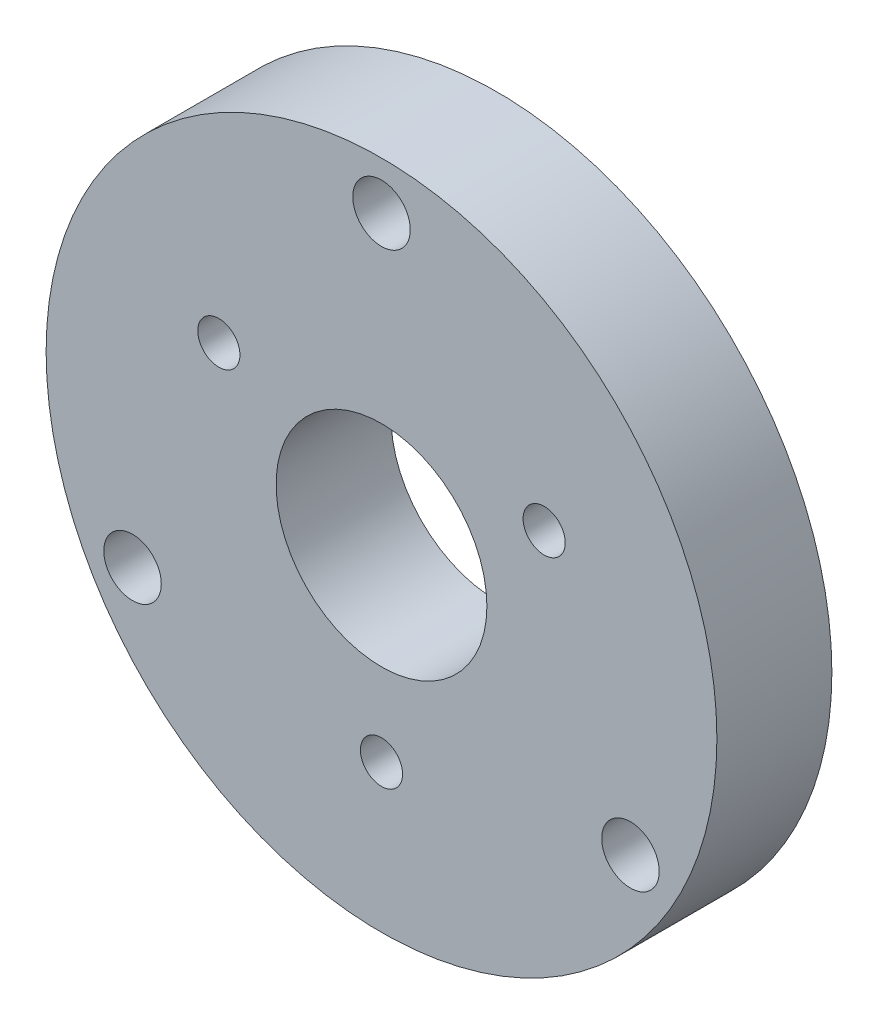
ISO-10303-21;
HEADER;
FILE_DESCRIPTION(('STEP AP214'),'2;1');
FILE_NAME('part.step','',(''),(''),'','','');
FILE_SCHEMA(('AUTOMOTIVE_DESIGN { 1 0 10303 214 1 1 1 1 }'));
ENDSEC;
DATA;
#1=APPLICATION_CONTEXT('core data for automotive mechanical design processes');
#2=APPLICATION_PROTOCOL_DEFINITION('international standard','automotive_design',2000,#1);
#3=PRODUCT_CONTEXT('',#1,'mechanical');
#4=PRODUCT('Part','Part','',(#3));
#5=PRODUCT_RELATED_PRODUCT_CATEGORY('part','',(#4));
#6=PRODUCT_DEFINITION_FORMATION('','',#4);
#7=PRODUCT_DEFINITION_CONTEXT('part definition',#1,'design');
#8=PRODUCT_DEFINITION('design','',#6,#7);
#9=PRODUCT_DEFINITION_SHAPE('','',#8);
#10=(LENGTH_UNIT() NAMED_UNIT(*) SI_UNIT(.MILLI.,.METRE.));
#11=(NAMED_UNIT(*) PLANE_ANGLE_UNIT() SI_UNIT($,.RADIAN.));
#12=(NAMED_UNIT(*) SI_UNIT($,.STERADIAN.) SOLID_ANGLE_UNIT());
#13=UNCERTAINTY_MEASURE_WITH_UNIT(LENGTH_MEASURE(1.E-05),#10,'distance_accuracy_value','');
#14=(GEOMETRIC_REPRESENTATION_CONTEXT(3) GLOBAL_UNCERTAINTY_ASSIGNED_CONTEXT((#13)) GLOBAL_UNIT_ASSIGNED_CONTEXT((#10,
#11,#12)) REPRESENTATION_CONTEXT('',''));
#15=CARTESIAN_POINT('',(0.,0.,0.));
#16=DIRECTION('',(0.,0.,1.));
#17=DIRECTION('',(1.,0.,0.));
#18=AXIS2_PLACEMENT_3D('',#15,#16,#17);
#19=CARTESIAN_POINT('',(0.,0.,6.));
#20=DIRECTION('',(0.,0.,1.));
#21=DIRECTION('',(1.,0.,0.));
#22=AXIS2_PLACEMENT_3D('',#19,#20,#21);
#23=PLANE('',#22);
#24=CARTESIAN_POINT('',(8.48704895708752,4.90000000000059,6.));
#25=DIRECTION('',(0.,0.,1.));
#26=DIRECTION('',(1.,0.,0.));
#27=AXIS2_PLACEMENT_3D('',#24,#25,#26);
#28=CIRCLE('',#27,1.1);
#29=CARTESIAN_POINT('',(9.58704895708752,4.90000000000059,6.));
#30=VERTEX_POINT('',#29);
#31=EDGE_CURVE('E74',#30,#30,#28,.F.);
#32=ORIENTED_EDGE('',*,*,#31,.T.);
#33=EDGE_LOOP('',(#32));
#34=FACE_BOUND('',#33,.T.);
#35=CARTESIAN_POINT('',(-12.9903810567656,-7.50000000000056,6.));
#36=DIRECTION('',(0.,0.,1.));
#37=DIRECTION('',(1.,0.,0.));
#38=AXIS2_PLACEMENT_3D('',#35,#36,#37);
#39=CIRCLE('',#38,1.50000000000122);
#40=CARTESIAN_POINT('',(-11.4903810567644,-7.50000000000056,6.));
#41=VERTEX_POINT('',#40);
#42=EDGE_CURVE('E60',#41,#41,#39,.T.);
#43=ORIENTED_EDGE('',*,*,#42,.F.);
#44=EDGE_LOOP('',(#43));
#45=FACE_BOUND('',#44,.T.);
#46=CARTESIAN_POINT('',(0.,0.,6.));
#47=DIRECTION('',(0.,0.,1.));
#48=DIRECTION('',(1.,0.,0.));
#49=AXIS2_PLACEMENT_3D('',#46,#47,#48);
#50=CIRCLE('',#49,5.5);
#51=CARTESIAN_POINT('',(5.5,0.,6.));
#52=VERTEX_POINT('',#51);
#53=EDGE_CURVE('E48',#52,#52,#50,.T.);
#54=ORIENTED_EDGE('',*,*,#53,.F.);
#55=EDGE_LOOP('',(#54));
#56=FACE_BOUND('',#55,.T.);
#57=CARTESIAN_POINT('',(0.,0.,6.));
#58=DIRECTION('',(0.,0.,1.));
#59=DIRECTION('',(1.,0.,0.));
#60=AXIS2_PLACEMENT_3D('',#57,#58,#59);
#61=CIRCLE('',#60,17.5);
#62=CARTESIAN_POINT('',(17.5,0.,6.));
#63=VERTEX_POINT('',#62);
#64=EDGE_CURVE('E10',#63,#63,#61,.T.);
#65=ORIENTED_EDGE('',*,*,#64,.T.);
#66=EDGE_LOOP('',(#65));
#67=FACE_BOUND('',#66,.T.);
#68=CARTESIAN_POINT('',(0.,15.,6.));
#69=DIRECTION('',(0.,0.,1.));
#70=DIRECTION('',(1.,0.,0.));
#71=AXIS2_PLACEMENT_3D('',#68,#69,#70);
#72=CIRCLE('',#71,1.5);
#73=CARTESIAN_POINT('',(1.5,15.,6.));
#74=VERTEX_POINT('',#73);
#75=EDGE_CURVE('E43',#74,#74,#72,.T.);
#76=ORIENTED_EDGE('',*,*,#75,.F.);
#77=EDGE_LOOP('',(#76));
#78=FACE_BOUND('',#77,.T.);
#79=CARTESIAN_POINT('',(12.9903810567675,-7.49999999999944,6.));
#80=DIRECTION('',(0.,0.,1.));
#81=DIRECTION('',(1.,0.,0.));
#82=AXIS2_PLACEMENT_3D('',#79,#80,#81);
#83=CIRCLE('',#82,1.50000000000082);
#84=CARTESIAN_POINT('',(14.4903810567684,-7.49999999999944,6.));
#85=VERTEX_POINT('',#84);
#86=EDGE_CURVE('E54',#85,#85,#83,.T.);
#87=ORIENTED_EDGE('',*,*,#86,.F.);
#88=EDGE_LOOP('',(#87));
#89=FACE_BOUND('',#88,.T.);
#90=CARTESIAN_POINT('',(-8.48704895708748,4.90000000000004,6.));
#91=DIRECTION('',(0.,0.,1.));
#92=DIRECTION('',(1.,0.,0.));
#93=AXIS2_PLACEMENT_3D('',#90,#91,#92);
#94=CIRCLE('',#93,1.1);
#95=CARTESIAN_POINT('',(-7.38704895708748,4.90000000000004,6.));
#96=VERTEX_POINT('',#95);
#97=EDGE_CURVE('E66',#96,#96,#94,.F.);
#98=ORIENTED_EDGE('',*,*,#97,.T.);
#99=EDGE_LOOP('',(#98));
#100=FACE_BOUND('',#99,.T.);
#101=CARTESIAN_POINT('',(4.9789781200289E-13,-9.79999999999969,6.));
#102=DIRECTION('',(0.,0.,1.));
#103=DIRECTION('',(1.,0.,0.));
#104=AXIS2_PLACEMENT_3D('',#101,#102,#103);
#105=CIRCLE('',#104,1.1);
#106=CARTESIAN_POINT('',(1.1000000000005,-9.79999999999969,6.));
#107=VERTEX_POINT('',#106);
#108=EDGE_CURVE('E80',#107,#107,#105,.F.);
#109=ORIENTED_EDGE('',*,*,#108,.T.);
#110=EDGE_LOOP('',(#109));
#111=FACE_BOUND('',#110,.T.);
#112=ADVANCED_FACE('F32',(#34,#45,#56,#67,#78,#89,#100,#111),#23,.T.);
#113=CARTESIAN_POINT('',(0.,0.,0.));
#114=DIRECTION('',(0.,0.,1.));
#115=DIRECTION('',(1.,0.,0.));
#116=AXIS2_PLACEMENT_3D('',#113,#114,#115);
#117=PLANE('',#116);
#118=CARTESIAN_POINT('',(8.48704895708752,4.90000000000059,0.));
#119=DIRECTION('',(0.,0.,1.));
#120=DIRECTION('',(1.,0.,0.));
#121=AXIS2_PLACEMENT_3D('',#118,#119,#120);
#122=CIRCLE('',#121,1.1);
#123=CARTESIAN_POINT('',(9.58704895708752,4.90000000000059,0.));
#124=VERTEX_POINT('',#123);
#125=EDGE_CURVE('E77',#124,#124,#122,.T.);
#126=ORIENTED_EDGE('',*,*,#125,.T.);
#127=EDGE_LOOP('',(#126));
#128=FACE_BOUND('',#127,.T.);
#129=CARTESIAN_POINT('',(-12.9903810567656,-7.50000000000056,0.));
#130=DIRECTION('',(0.,0.,1.));
#131=DIRECTION('',(1.,0.,0.));
#132=AXIS2_PLACEMENT_3D('',#129,#130,#131);
#133=CIRCLE('',#132,1.50000000000122);
#134=CARTESIAN_POINT('',(-11.4903810567644,-7.50000000000056,0.));
#135=VERTEX_POINT('',#134);
#136=EDGE_CURVE('E63',#135,#135,#133,.T.);
#137=ORIENTED_EDGE('',*,*,#136,.T.);
#138=EDGE_LOOP('',(#137));
#139=FACE_BOUND('',#138,.T.);
#140=CARTESIAN_POINT('',(0.,0.,0.));
#141=DIRECTION('',(0.,0.,1.));
#142=DIRECTION('',(1.,0.,0.));
#143=AXIS2_PLACEMENT_3D('',#140,#141,#142);
#144=CIRCLE('',#143,5.5);
#145=CARTESIAN_POINT('',(5.5,0.,0.));
#146=VERTEX_POINT('',#145);
#147=EDGE_CURVE('E51',#146,#146,#144,.T.);
#148=ORIENTED_EDGE('',*,*,#147,.T.);
#149=EDGE_LOOP('',(#148));
#150=FACE_BOUND('',#149,.T.);
#151=CARTESIAN_POINT('',(0.,0.,0.));
#152=DIRECTION('',(0.,0.,1.));
#153=DIRECTION('',(1.,0.,0.));
#154=AXIS2_PLACEMENT_3D('',#151,#152,#153);
#155=CIRCLE('',#154,17.5);
#156=CARTESIAN_POINT('',(17.5,0.,0.));
#157=VERTEX_POINT('',#156);
#158=EDGE_CURVE('E36',#157,#157,#155,.T.);
#159=ORIENTED_EDGE('',*,*,#158,.F.);
#160=EDGE_LOOP('',(#159));
#161=FACE_BOUND('',#160,.T.);
#162=CARTESIAN_POINT('',(0.,15.,0.));
#163=DIRECTION('',(0.,0.,1.));
#164=DIRECTION('',(1.,0.,0.));
#165=AXIS2_PLACEMENT_3D('',#162,#163,#164);
#166=CIRCLE('',#165,1.5);
#167=CARTESIAN_POINT('',(1.5,15.,0.));
#168=VERTEX_POINT('',#167);
#169=EDGE_CURVE('E45',#168,#168,#166,.T.);
#170=ORIENTED_EDGE('',*,*,#169,.T.);
#171=EDGE_LOOP('',(#170));
#172=FACE_BOUND('',#171,.T.);
#173=CARTESIAN_POINT('',(12.9903810567675,-7.49999999999944,0.));
#174=DIRECTION('',(0.,0.,1.));
#175=DIRECTION('',(1.,0.,0.));
#176=AXIS2_PLACEMENT_3D('',#173,#174,#175);
#177=CIRCLE('',#176,1.50000000000082);
#178=CARTESIAN_POINT('',(14.4903810567684,-7.49999999999944,0.));
#179=VERTEX_POINT('',#178);
#180=EDGE_CURVE('E57',#179,#179,#177,.T.);
#181=ORIENTED_EDGE('',*,*,#180,.T.);
#182=EDGE_LOOP('',(#181));
#183=FACE_BOUND('',#182,.T.);
#184=CARTESIAN_POINT('',(-8.48704895708748,4.90000000000004,0.));
#185=DIRECTION('',(0.,0.,1.));
#186=DIRECTION('',(1.,0.,0.));
#187=AXIS2_PLACEMENT_3D('',#184,#185,#186);
#188=CIRCLE('',#187,1.1);
#189=CARTESIAN_POINT('',(-7.38704895708748,4.90000000000004,0.));
#190=VERTEX_POINT('',#189);
#191=EDGE_CURVE('E71',#190,#190,#188,.T.);
#192=ORIENTED_EDGE('',*,*,#191,.T.);
#193=EDGE_LOOP('',(#192));
#194=FACE_BOUND('',#193,.T.);
#195=CARTESIAN_POINT('',(4.9789781200289E-13,-9.79999999999969,0.));
#196=DIRECTION('',(0.,0.,1.));
#197=DIRECTION('',(1.,0.,0.));
#198=AXIS2_PLACEMENT_3D('',#195,#196,#197);
#199=CIRCLE('',#198,1.1);
#200=CARTESIAN_POINT('',(1.1000000000005,-9.79999999999969,0.));
#201=VERTEX_POINT('',#200);
#202=EDGE_CURVE('E83',#201,#201,#199,.T.);
#203=ORIENTED_EDGE('',*,*,#202,.T.);
#204=EDGE_LOOP('',(#203));
#205=FACE_BOUND('',#204,.T.);
#206=ADVANCED_FACE('F87',(#128,#139,#150,#161,#172,#183,#194,#205),#117,.F.);
#207=CARTESIAN_POINT('',(0.,0.,6.));
#208=DIRECTION('',(0.,0.,-1.));
#209=DIRECTION('',(-1.,0.,0.));
#210=AXIS2_PLACEMENT_3D('',#207,#208,#209);
#211=CYLINDRICAL_SURFACE('',#210,17.5);
#212=ORIENTED_EDGE('',*,*,#64,.F.);
#213=EDGE_LOOP('',(#212));
#214=FACE_BOUND('',#213,.T.);
#215=ORIENTED_EDGE('',*,*,#158,.T.);
#216=EDGE_LOOP('',(#215));
#217=FACE_BOUND('',#216,.T.);
#218=ADVANCED_FACE('F34',(#214,#217),#211,.T.);
#219=CARTESIAN_POINT('',(0.,15.,6.));
#220=DIRECTION('',(0.,0.,-1.));
#221=DIRECTION('',(-1.,0.,0.));
#222=AXIS2_PLACEMENT_3D('',#219,#220,#221);
#223=CYLINDRICAL_SURFACE('',#222,1.5);
#224=ORIENTED_EDGE('',*,*,#75,.T.);
#225=EDGE_LOOP('',(#224));
#226=FACE_BOUND('',#225,.T.);
#227=ORIENTED_EDGE('',*,*,#169,.F.);
#228=EDGE_LOOP('',(#227));
#229=FACE_BOUND('',#228,.T.);
#230=ADVANCED_FACE('F110',(#226,#229),#223,.F.);
#231=CARTESIAN_POINT('',(0.,0.,6.));
#232=DIRECTION('',(0.,0.,-1.));
#233=DIRECTION('',(-1.,0.,0.));
#234=AXIS2_PLACEMENT_3D('',#231,#232,#233);
#235=CYLINDRICAL_SURFACE('',#234,5.5);
#236=ORIENTED_EDGE('',*,*,#53,.T.);
#237=EDGE_LOOP('',(#236));
#238=FACE_BOUND('',#237,.T.);
#239=ORIENTED_EDGE('',*,*,#147,.F.);
#240=EDGE_LOOP('',(#239));
#241=FACE_BOUND('',#240,.T.);
#242=ADVANCED_FACE('F113',(#238,#241),#235,.F.);
#243=CARTESIAN_POINT('',(12.9903810567675,-7.49999999999944,6.));
#244=DIRECTION('',(0.,0.,-1.));
#245=DIRECTION('',(-1.,0.,0.));
#246=AXIS2_PLACEMENT_3D('',#243,#244,#245);
#247=CYLINDRICAL_SURFACE('',#246,1.50000000000082);
#248=ORIENTED_EDGE('',*,*,#86,.T.);
#249=EDGE_LOOP('',(#248));
#250=FACE_BOUND('',#249,.T.);
#251=ORIENTED_EDGE('',*,*,#180,.F.);
#252=EDGE_LOOP('',(#251));
#253=FACE_BOUND('',#252,.T.);
#254=ADVANCED_FACE('F117',(#250,#253),#247,.F.);
#255=CARTESIAN_POINT('',(-12.9903810567656,-7.50000000000056,6.));
#256=DIRECTION('',(0.,0.,-1.));
#257=DIRECTION('',(-1.,0.,0.));
#258=AXIS2_PLACEMENT_3D('',#255,#256,#257);
#259=CYLINDRICAL_SURFACE('',#258,1.50000000000122);
#260=ORIENTED_EDGE('',*,*,#42,.T.);
#261=EDGE_LOOP('',(#260));
#262=FACE_BOUND('',#261,.T.);
#263=ORIENTED_EDGE('',*,*,#136,.F.);
#264=EDGE_LOOP('',(#263));
#265=FACE_BOUND('',#264,.T.);
#266=ADVANCED_FACE('F121',(#262,#265),#259,.F.);
#267=CARTESIAN_POINT('',(-8.48704895708748,4.90000000000004,19.));
#268=DIRECTION('',(0.,0.,-1.));
#269=DIRECTION('',(-1.,0.,0.));
#270=AXIS2_PLACEMENT_3D('',#267,#268,#269);
#271=CYLINDRICAL_SURFACE('',#270,1.1);
#272=ORIENTED_EDGE('',*,*,#97,.F.);
#273=EDGE_LOOP('',(#272));
#274=FACE_BOUND('',#273,.T.);
#275=ORIENTED_EDGE('',*,*,#191,.F.);
#276=EDGE_LOOP('',(#275));
#277=FACE_BOUND('',#276,.T.);
#278=ADVANCED_FACE('F97',(#274,#277),#271,.F.);
#279=CARTESIAN_POINT('',(8.48704895708752,4.90000000000059,19.));
#280=DIRECTION('',(0.,0.,-1.));
#281=DIRECTION('',(-1.,0.,0.));
#282=AXIS2_PLACEMENT_3D('',#279,#280,#281);
#283=CYLINDRICAL_SURFACE('',#282,1.1);
#284=ORIENTED_EDGE('',*,*,#31,.F.);
#285=EDGE_LOOP('',(#284));
#286=FACE_BOUND('',#285,.T.);
#287=ORIENTED_EDGE('',*,*,#125,.F.);
#288=EDGE_LOOP('',(#287));
#289=FACE_BOUND('',#288,.T.);
#290=ADVANCED_FACE('F91',(#286,#289),#283,.F.);
#291=CARTESIAN_POINT('',(4.9789781200289E-13,-9.79999999999969,19.));
#292=DIRECTION('',(0.,0.,-1.));
#293=DIRECTION('',(-1.,0.,0.));
#294=AXIS2_PLACEMENT_3D('',#291,#292,#293);
#295=CYLINDRICAL_SURFACE('',#294,1.1);
#296=ORIENTED_EDGE('',*,*,#108,.F.);
#297=EDGE_LOOP('',(#296));
#298=FACE_BOUND('',#297,.T.);
#299=ORIENTED_EDGE('',*,*,#202,.F.);
#300=EDGE_LOOP('',(#299));
#301=FACE_BOUND('',#300,.T.);
#302=ADVANCED_FACE('F89',(#298,#301),#295,.F.);
#303=CLOSED_SHELL('',(#112,#206,#218,#230,#242,#254,#266,#278,#290,#302));
#304=MANIFOLD_SOLID_BREP('B2',#303);
#305=ADVANCED_BREP_SHAPE_REPRESENTATION('',(#18,#304),#14);
#306=SHAPE_DEFINITION_REPRESENTATION(#9,#305);
ENDSEC;
END-ISO-10303-21;
